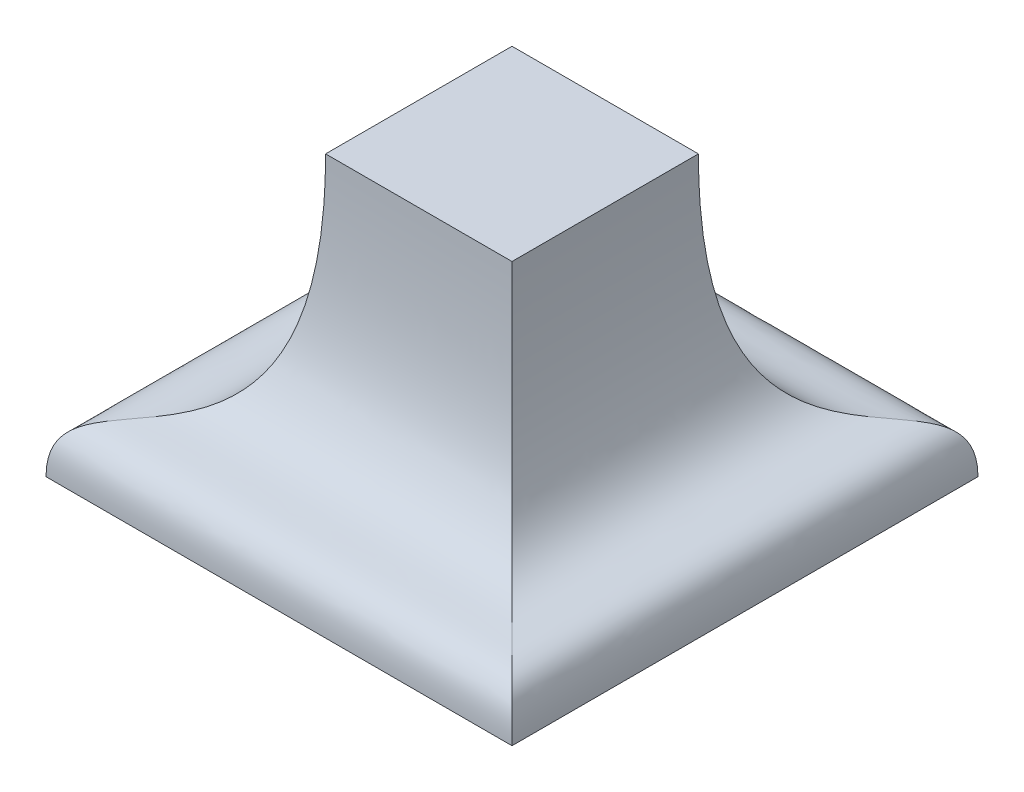
ISO-10303-21;
HEADER;
FILE_DESCRIPTION(('STEP AP214'),'2;1');
FILE_NAME('part.step','',(''),(''),'','','');
FILE_SCHEMA(('AUTOMOTIVE_DESIGN { 1 0 10303 214 1 1 1 1 }'));
ENDSEC;
DATA;
#1=APPLICATION_CONTEXT('core data for automotive mechanical design processes');
#2=APPLICATION_PROTOCOL_DEFINITION('international standard','automotive_design',2000,#1);
#3=PRODUCT_CONTEXT('',#1,'mechanical');
#4=PRODUCT('Part','Part','',(#3));
#5=PRODUCT_RELATED_PRODUCT_CATEGORY('part','',(#4));
#6=PRODUCT_DEFINITION_FORMATION('','',#4);
#7=PRODUCT_DEFINITION_CONTEXT('part definition',#1,'design');
#8=PRODUCT_DEFINITION('design','',#6,#7);
#9=PRODUCT_DEFINITION_SHAPE('','',#8);
#10=(LENGTH_UNIT() NAMED_UNIT(*) SI_UNIT(.MILLI.,.METRE.));
#11=(NAMED_UNIT(*) PLANE_ANGLE_UNIT() SI_UNIT($,.RADIAN.));
#12=(NAMED_UNIT(*) SI_UNIT($,.STERADIAN.) SOLID_ANGLE_UNIT());
#13=UNCERTAINTY_MEASURE_WITH_UNIT(LENGTH_MEASURE(1.E-05),#10,'distance_accuracy_value','');
#14=(GEOMETRIC_REPRESENTATION_CONTEXT(3) GLOBAL_UNCERTAINTY_ASSIGNED_CONTEXT((#13)) GLOBAL_UNIT_ASSIGNED_CONTEXT((#10,
#11,#12)) REPRESENTATION_CONTEXT('',''));
#15=CARTESIAN_POINT('',(0.,0.,0.));
#16=DIRECTION('',(0.,0.,1.));
#17=DIRECTION('',(1.,0.,0.));
#18=AXIS2_PLACEMENT_3D('',#15,#16,#17);
#19=CARTESIAN_POINT('',(0.,76.2,0.));
#20=DIRECTION('',(0.,-1.,0.));
#21=DIRECTION('',(0.,0.,-1.));
#22=AXIS2_PLACEMENT_3D('',#19,#20,#21);
#23=PLANE('',#22);
#24=DIRECTION('',(0.,0.,-1.));
#25=VECTOR('',#24,1.);
#26=CARTESIAN_POINT('',(25.4,76.2,25.4));
#27=LINE('',#26,#25);
#28=CARTESIAN_POINT('',(25.4,76.2,25.4));
#29=VERTEX_POINT('',#28);
#30=CARTESIAN_POINT('',(25.4,76.2,-25.4));
#31=VERTEX_POINT('',#30);
#32=EDGE_CURVE('E157',#29,#31,#27,.T.);
#33=ORIENTED_EDGE('',*,*,#32,.T.);
#34=DIRECTION('',(-1.,0.,0.));
#35=VECTOR('',#34,1.);
#36=CARTESIAN_POINT('',(-25.4,76.2,-25.4));
#37=LINE('',#36,#35);
#38=CARTESIAN_POINT('',(-25.4,76.2,-25.4));
#39=VERTEX_POINT('',#38);
#40=EDGE_CURVE('E159',#31,#39,#37,.T.);
#41=ORIENTED_EDGE('',*,*,#40,.T.);
#42=DIRECTION('',(0.,0.,1.));
#43=VECTOR('',#42,1.);
#44=CARTESIAN_POINT('',(-25.4,76.2,25.4));
#45=LINE('',#44,#43);
#46=CARTESIAN_POINT('',(-25.4,76.2,25.4));
#47=VERTEX_POINT('',#46);
#48=EDGE_CURVE('E93',#39,#47,#45,.T.);
#49=ORIENTED_EDGE('',*,*,#48,.T.);
#50=DIRECTION('',(1.,0.,0.));
#51=VECTOR('',#50,1.);
#52=CARTESIAN_POINT('',(-25.4,76.2,25.4));
#53=LINE('',#52,#51);
#54=EDGE_CURVE('E12',#47,#29,#53,.T.);
#55=ORIENTED_EDGE('',*,*,#54,.T.);
#56=EDGE_LOOP('',(#33,#41,#49,#55));
#57=FACE_BOUND('',#56,.T.);
#58=ADVANCED_FACE('F83',(#57),#23,.F.);
#59=CARTESIAN_POINT('',(0.,0.,0.));
#60=DIRECTION('',(0.,-1.,0.));
#61=DIRECTION('',(0.,0.,-1.));
#62=AXIS2_PLACEMENT_3D('',#59,#60,#61);
#63=PLANE('',#62);
#64=DIRECTION('',(0.,0.,-1.));
#65=VECTOR('',#64,1.);
#66=CARTESIAN_POINT('',(63.5,0.,63.5));
#67=LINE('',#66,#65);
#68=CARTESIAN_POINT('',(63.5,0.,63.5));
#69=VERTEX_POINT('',#68);
#70=CARTESIAN_POINT('',(63.5,0.,-63.5));
#71=VERTEX_POINT('',#70);
#72=EDGE_CURVE('E151',#69,#71,#67,.T.);
#73=ORIENTED_EDGE('',*,*,#72,.F.);
#74=DIRECTION('',(1.,0.,0.));
#75=VECTOR('',#74,1.);
#76=CARTESIAN_POINT('',(-63.5,0.,63.5));
#77=LINE('',#76,#75);
#78=CARTESIAN_POINT('',(-63.5,0.,63.5));
#79=VERTEX_POINT('',#78);
#80=EDGE_CURVE('E135',#79,#69,#77,.T.);
#81=ORIENTED_EDGE('',*,*,#80,.F.);
#82=DIRECTION('',(0.,0.,1.));
#83=VECTOR('',#82,1.);
#84=CARTESIAN_POINT('',(-63.5,0.,63.5));
#85=LINE('',#84,#83);
#86=CARTESIAN_POINT('',(-63.5,0.,-63.5));
#87=VERTEX_POINT('',#86);
#88=EDGE_CURVE('E126',#87,#79,#85,.T.);
#89=ORIENTED_EDGE('',*,*,#88,.F.);
#90=DIRECTION('',(-1.,0.,0.));
#91=VECTOR('',#90,1.);
#92=CARTESIAN_POINT('',(-63.5,0.,-63.5));
#93=LINE('',#92,#91);
#94=EDGE_CURVE('E131',#71,#87,#93,.T.);
#95=ORIENTED_EDGE('',*,*,#94,.F.);
#96=EDGE_LOOP('',(#73,#81,#89,#95));
#97=FACE_BOUND('',#96,.T.);
#98=ADVANCED_FACE('F130',(#97),#63,.T.);
#99=CARTESIAN_POINT('',(-63.5,0.,63.5));
#100=CARTESIAN_POINT('',(-63.5,32.3528605226802,63.5));
#101=CARTESIAN_POINT('',(-25.4,-17.1255592000391,25.4));
#102=CARTESIAN_POINT('',(-25.4,76.2,25.4));
#103=CARTESIAN_POINT('',(-21.1666666666667,0.,63.5));
#104=CARTESIAN_POINT('',(-21.1666666666667,32.3528605226802,63.5));
#105=CARTESIAN_POINT('',(-8.46666666666667,-17.1255592000391,25.4));
#106=CARTESIAN_POINT('',(-8.46666666666667,76.2,25.4));
#107=CARTESIAN_POINT('',(21.1666666666667,0.,63.5));
#108=CARTESIAN_POINT('',(21.1666666666667,32.3528605226802,63.5));
#109=CARTESIAN_POINT('',(8.46666666666665,-17.1255592000391,25.4));
#110=CARTESIAN_POINT('',(8.46666666666665,76.2,25.4));
#111=CARTESIAN_POINT('',(63.5,0.,63.5));
#112=CARTESIAN_POINT('',(63.5,32.3528605226802,63.5));
#113=CARTESIAN_POINT('',(25.4,-17.1255592000391,25.4));
#114=CARTESIAN_POINT('',(25.4,76.2,25.4));
#115=B_SPLINE_SURFACE_WITH_KNOTS('',3,3,((#99,#100,#101,#102),(#103,#104,#105,#106),(#107,#108,
#109,#110),(#111,#112,#113,#114)),.UNSPECIFIED.,.F.,.F.,.F.,(4,4),(4,4),(0.,1.),(0.,1.),.UNSPECIFIED.);
#116=CARTESIAN_POINT('',(63.5,0.,63.5));
#117=CARTESIAN_POINT('',(63.5,32.3528605226802,63.5));
#118=CARTESIAN_POINT('',(25.4,-17.1255592000391,25.4));
#119=CARTESIAN_POINT('',(25.4,76.2,25.4));
#120=B_SPLINE_CURVE_WITH_KNOTS('',3,(#116,#117,#118,#119),.UNSPECIFIED.,.F.,.F.,(4,4),(0.,1.),.UNSPECIFIED.);
#121=EDGE_CURVE('E161',#69,#29,#120,.T.);
#122=CARTESIAN_POINT('',(-63.5,0.,63.5));
#123=CARTESIAN_POINT('',(-63.5,32.3528605226802,63.5));
#124=CARTESIAN_POINT('',(-25.4,-17.1255592000391,25.4));
#125=CARTESIAN_POINT('',(-25.4,76.2,25.4));
#126=B_SPLINE_CURVE_WITH_KNOTS('',3,(#122,#123,#124,#125),.UNSPECIFIED.,.F.,.F.,(4,4),(0.,1.),.UNSPECIFIED.);
#127=EDGE_CURVE('E108',#47,#79,#126,.F.);
#128=ORIENTED_EDGE('',*,*,#80,.T.);
#129=ORIENTED_EDGE('',*,*,#121,.T.);
#130=ORIENTED_EDGE('',*,*,#54,.F.);
#131=ORIENTED_EDGE('',*,*,#127,.T.);
#132=EDGE_LOOP('',(#128,#129,#130,#131));
#133=FACE_BOUND('',#132,.T.);
#134=ADVANCED_FACE('F234',(#133),#115,.T.);
#135=CARTESIAN_POINT('',(63.5,0.,63.5));
#136=CARTESIAN_POINT('',(63.5,32.3528605226802,63.5));
#137=CARTESIAN_POINT('',(25.4,-17.1255592000391,25.4));
#138=CARTESIAN_POINT('',(25.4,76.2,25.4));
#139=CARTESIAN_POINT('',(63.5,0.,21.1666666666667));
#140=CARTESIAN_POINT('',(63.5,32.3528605226802,21.1666666666667));
#141=CARTESIAN_POINT('',(25.4,-17.1255592000391,8.46666666666666));
#142=CARTESIAN_POINT('',(25.4,76.2,8.46666666666666));
#143=CARTESIAN_POINT('',(63.5,0.,-21.1666666666667));
#144=CARTESIAN_POINT('',(63.5,32.3528605226802,-21.1666666666667));
#145=CARTESIAN_POINT('',(25.4,-17.1255592000391,-8.46666666666667));
#146=CARTESIAN_POINT('',(25.4,76.2,-8.46666666666667));
#147=CARTESIAN_POINT('',(63.5,0.,-63.5));
#148=CARTESIAN_POINT('',(63.5,32.3528605226802,-63.5));
#149=CARTESIAN_POINT('',(25.4,-17.1255592000391,-25.4));
#150=CARTESIAN_POINT('',(25.4,76.2,-25.4));
#151=B_SPLINE_SURFACE_WITH_KNOTS('',3,3,((#135,#136,#137,#138),(#139,#140,#141,#142),(#143,#144,
#145,#146),(#147,#148,#149,#150)),.UNSPECIFIED.,.F.,.F.,.F.,(4,4),(4,4),(0.,1.),(0.,1.),.UNSPECIFIED.);
#152=CARTESIAN_POINT('',(63.5,0.,-63.5));
#153=CARTESIAN_POINT('',(63.5,32.3528605226802,-63.5));
#154=CARTESIAN_POINT('',(25.4,-17.1255592000391,-25.4));
#155=CARTESIAN_POINT('',(25.4,76.2,-25.4));
#156=B_SPLINE_CURVE_WITH_KNOTS('',3,(#152,#153,#154,#155),.UNSPECIFIED.,.F.,.F.,(4,4),(0.,1.),.UNSPECIFIED.);
#157=EDGE_CURVE('E150',#71,#31,#156,.T.);
#158=ORIENTED_EDGE('',*,*,#72,.T.);
#159=ORIENTED_EDGE('',*,*,#157,.T.);
#160=ORIENTED_EDGE('',*,*,#32,.F.);
#161=ORIENTED_EDGE('',*,*,#121,.F.);
#162=EDGE_LOOP('',(#158,#159,#160,#161));
#163=FACE_BOUND('',#162,.T.);
#164=ADVANCED_FACE('F188',(#163),#151,.T.);
#165=CARTESIAN_POINT('',(-63.5,0.,-63.5));
#166=CARTESIAN_POINT('',(-63.5,32.3528605226802,-63.5));
#167=CARTESIAN_POINT('',(-25.4,-17.1255592000391,-25.4));
#168=CARTESIAN_POINT('',(-25.4,76.2,-25.4));
#169=CARTESIAN_POINT('',(-63.5,0.,-21.1666666666667));
#170=CARTESIAN_POINT('',(-63.5,32.3528605226802,-21.1666666666667));
#171=CARTESIAN_POINT('',(-25.4,-17.1255592000391,-8.46666666666667));
#172=CARTESIAN_POINT('',(-25.4,76.2,-8.46666666666667));
#173=CARTESIAN_POINT('',(-63.5,0.,21.1666666666667));
#174=CARTESIAN_POINT('',(-63.5,32.3528605226802,21.1666666666667));
#175=CARTESIAN_POINT('',(-25.4,-17.1255592000391,8.46666666666666));
#176=CARTESIAN_POINT('',(-25.4,76.2,8.46666666666666));
#177=CARTESIAN_POINT('',(-63.5,0.,63.5));
#178=CARTESIAN_POINT('',(-63.5,32.3528605226802,63.5));
#179=CARTESIAN_POINT('',(-25.4,-17.1255592000391,25.4));
#180=CARTESIAN_POINT('',(-25.4,76.2,25.4));
#181=B_SPLINE_SURFACE_WITH_KNOTS('',3,3,((#165,#166,#167,#168),(#169,#170,#171,#172),(#173,#174,
#175,#176),(#177,#178,#179,#180)),.UNSPECIFIED.,.F.,.F.,.F.,(4,4),(4,4),(0.,1.),(0.,1.),.UNSPECIFIED.);
#182=CARTESIAN_POINT('',(-63.5,0.,-63.5));
#183=CARTESIAN_POINT('',(-63.5,32.3528605226802,-63.5));
#184=CARTESIAN_POINT('',(-25.4,-17.1255592000391,-25.4));
#185=CARTESIAN_POINT('',(-25.4,76.2,-25.4));
#186=B_SPLINE_CURVE_WITH_KNOTS('',3,(#182,#183,#184,#185),.UNSPECIFIED.,.F.,.F.,(4,4),(0.,1.),.UNSPECIFIED.);
#187=EDGE_CURVE('E147',#87,#39,#186,.T.);
#188=ORIENTED_EDGE('',*,*,#88,.T.);
#189=ORIENTED_EDGE('',*,*,#127,.F.);
#190=ORIENTED_EDGE('',*,*,#48,.F.);
#191=ORIENTED_EDGE('',*,*,#187,.F.);
#192=EDGE_LOOP('',(#188,#189,#190,#191));
#193=FACE_BOUND('',#192,.T.);
#194=ADVANCED_FACE('F155',(#193),#181,.T.);
#195=CARTESIAN_POINT('',(63.5,0.,-63.5));
#196=CARTESIAN_POINT('',(63.5,32.3528605226802,-63.5));
#197=CARTESIAN_POINT('',(25.4,-17.1255592000391,-25.4));
#198=CARTESIAN_POINT('',(25.4,76.2,-25.4));
#199=CARTESIAN_POINT('',(21.1666666666667,0.,-63.5));
#200=CARTESIAN_POINT('',(21.1666666666667,32.3528605226802,-63.5));
#201=CARTESIAN_POINT('',(8.46666666666665,-17.1255592000391,-25.4));
#202=CARTESIAN_POINT('',(8.46666666666665,76.2,-25.4));
#203=CARTESIAN_POINT('',(-21.1666666666667,0.,-63.5));
#204=CARTESIAN_POINT('',(-21.1666666666667,32.3528605226802,-63.5));
#205=CARTESIAN_POINT('',(-8.46666666666667,-17.1255592000391,-25.4));
#206=CARTESIAN_POINT('',(-8.46666666666667,76.2,-25.4));
#207=CARTESIAN_POINT('',(-63.5,0.,-63.5));
#208=CARTESIAN_POINT('',(-63.5,32.3528605226802,-63.5));
#209=CARTESIAN_POINT('',(-25.4,-17.1255592000391,-25.4));
#210=CARTESIAN_POINT('',(-25.4,76.2,-25.4));
#211=B_SPLINE_SURFACE_WITH_KNOTS('',3,3,((#195,#196,#197,#198),(#199,#200,#201,#202),(#203,#204,
#205,#206),(#207,#208,#209,#210)),.UNSPECIFIED.,.F.,.F.,.F.,(4,4),(4,4),(0.,1.),(0.,1.),.UNSPECIFIED.);
#212=ORIENTED_EDGE('',*,*,#94,.T.);
#213=ORIENTED_EDGE('',*,*,#187,.T.);
#214=ORIENTED_EDGE('',*,*,#40,.F.);
#215=ORIENTED_EDGE('',*,*,#157,.F.);
#216=EDGE_LOOP('',(#212,#213,#214,#215));
#217=FACE_BOUND('',#216,.T.);
#218=ADVANCED_FACE('F146',(#217),#211,.T.);
#219=CLOSED_SHELL('',(#58,#98,#134,#164,#194,#218));
#220=MANIFOLD_SOLID_BREP('B2',#219);
#221=ADVANCED_BREP_SHAPE_REPRESENTATION('',(#18,#220),#14);
#222=SHAPE_DEFINITION_REPRESENTATION(#9,#221);
ENDSEC;
END-ISO-10303-21;
